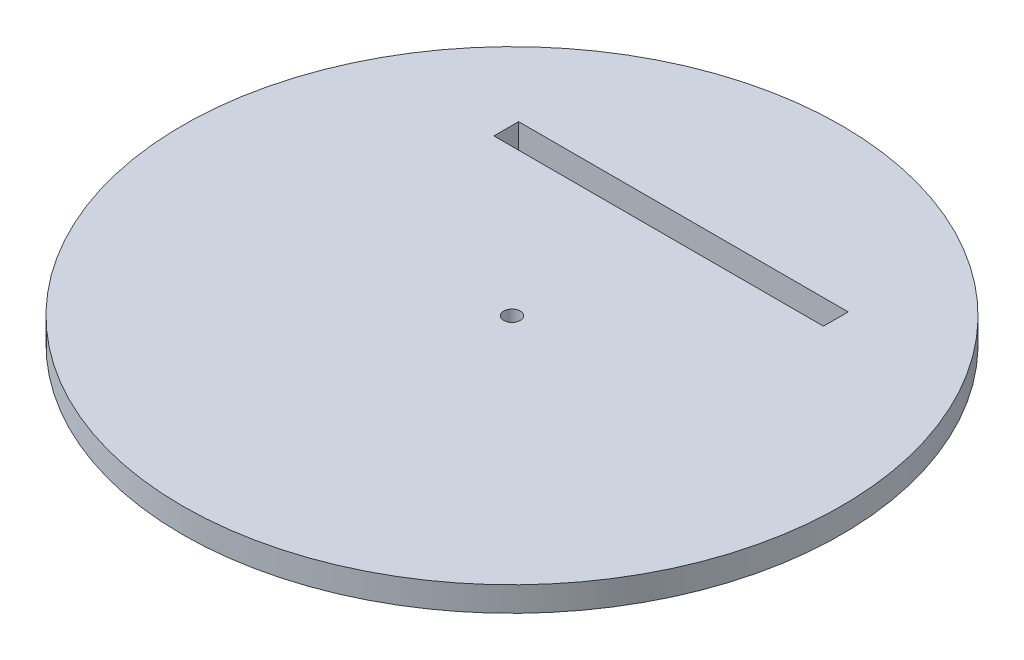
ISO-10303-21;
HEADER;
FILE_DESCRIPTION(('STEP AP214'),'2;1');
FILE_NAME('part.step','',(''),(''),'','','');
FILE_SCHEMA(('AUTOMOTIVE_DESIGN { 1 0 10303 214 1 1 1 1 }'));
ENDSEC;
DATA;
#1=APPLICATION_CONTEXT('core data for automotive mechanical design processes');
#2=APPLICATION_PROTOCOL_DEFINITION('international standard','automotive_design',2000,#1);
#3=PRODUCT_CONTEXT('',#1,'mechanical');
#4=PRODUCT('Part','Part','',(#3));
#5=PRODUCT_RELATED_PRODUCT_CATEGORY('part','',(#4));
#6=PRODUCT_DEFINITION_FORMATION('','',#4);
#7=PRODUCT_DEFINITION_CONTEXT('part definition',#1,'design');
#8=PRODUCT_DEFINITION('design','',#6,#7);
#9=PRODUCT_DEFINITION_SHAPE('','',#8);
#10=(LENGTH_UNIT() NAMED_UNIT(*) SI_UNIT(.MILLI.,.METRE.));
#11=(NAMED_UNIT(*) PLANE_ANGLE_UNIT() SI_UNIT($,.RADIAN.));
#12=(NAMED_UNIT(*) SI_UNIT($,.STERADIAN.) SOLID_ANGLE_UNIT());
#13=UNCERTAINTY_MEASURE_WITH_UNIT(LENGTH_MEASURE(1.E-05),#10,'distance_accuracy_value','');
#14=(GEOMETRIC_REPRESENTATION_CONTEXT(3) GLOBAL_UNCERTAINTY_ASSIGNED_CONTEXT((#13)) GLOBAL_UNIT_ASSIGNED_CONTEXT((#10,
#11,#12)) REPRESENTATION_CONTEXT('',''));
#15=CARTESIAN_POINT('',(0.,0.,0.));
#16=DIRECTION('',(0.,0.,1.));
#17=DIRECTION('',(1.,0.,0.));
#18=AXIS2_PLACEMENT_3D('',#15,#16,#17);
#19=CARTESIAN_POINT('',(0.,3.,0.));
#20=DIRECTION('',(0.,-1.,0.));
#21=DIRECTION('',(0.,0.,-1.));
#22=AXIS2_PLACEMENT_3D('',#19,#20,#21);
#23=CYLINDRICAL_SURFACE('',#22,40.);
#24=CARTESIAN_POINT('',(0.,3.,0.));
#25=DIRECTION('',(0.,1.,0.));
#26=DIRECTION('',(0.,0.,1.));
#27=AXIS2_PLACEMENT_3D('',#24,#25,#26);
#28=CIRCLE('',#27,40.);
#29=CARTESIAN_POINT('',(0.,3.,40.));
#30=VERTEX_POINT('',#29);
#31=EDGE_CURVE('E108',#30,#30,#28,.T.);
#32=ORIENTED_EDGE('',*,*,#31,.F.);
#33=EDGE_LOOP('',(#32));
#34=FACE_BOUND('',#33,.T.);
#35=CARTESIAN_POINT('',(0.,0.,0.));
#36=DIRECTION('',(0.,1.,0.));
#37=DIRECTION('',(0.,0.,1.));
#38=AXIS2_PLACEMENT_3D('',#35,#36,#37);
#39=CIRCLE('',#38,40.);
#40=CARTESIAN_POINT('',(0.,0.,40.));
#41=VERTEX_POINT('',#40);
#42=EDGE_CURVE('E105',#41,#41,#39,.T.);
#43=ORIENTED_EDGE('',*,*,#42,.T.);
#44=EDGE_LOOP('',(#43));
#45=FACE_BOUND('',#44,.T.);
#46=ADVANCED_FACE('F33',(#34,#45),#23,.T.);
#47=CARTESIAN_POINT('',(0.,3.,0.));
#48=DIRECTION('',(0.,1.,0.));
#49=DIRECTION('',(0.,0.,1.));
#50=AXIS2_PLACEMENT_3D('',#47,#48,#49);
#51=PLANE('',#50);
#52=DIRECTION('',(0.,0.,1.));
#53=VECTOR('',#52,1.);
#54=CARTESIAN_POINT('',(-20.,3.,-20.8028373281195));
#55=LINE('',#54,#53);
#56=CARTESIAN_POINT('',(-20.,3.,-20.8028373281195));
#57=VERTEX_POINT('',#56);
#58=CARTESIAN_POINT('',(-20.,3.,-17.8028373281195));
#59=VERTEX_POINT('',#58);
#60=EDGE_CURVE('E47',#57,#59,#55,.T.);
#61=ORIENTED_EDGE('',*,*,#60,.F.);
#62=DIRECTION('',(-1.,0.,0.));
#63=VECTOR('',#62,1.);
#64=CARTESIAN_POINT('',(-20.,3.,-20.8028373281195));
#65=LINE('',#64,#63);
#66=CARTESIAN_POINT('',(20.,3.,-20.8028373281195));
#67=VERTEX_POINT('',#66);
#68=EDGE_CURVE('E92',#67,#57,#65,.T.);
#69=ORIENTED_EDGE('',*,*,#68,.F.);
#70=DIRECTION('',(0.,0.,-1.));
#71=VECTOR('',#70,1.);
#72=CARTESIAN_POINT('',(20.,3.,-20.8028373281195));
#73=LINE('',#72,#71);
#74=CARTESIAN_POINT('',(20.,3.,-17.8028373281195));
#75=VERTEX_POINT('',#74);
#76=EDGE_CURVE('E76',#75,#67,#73,.T.);
#77=ORIENTED_EDGE('',*,*,#76,.F.);
#78=DIRECTION('',(1.,0.,0.));
#79=VECTOR('',#78,1.);
#80=CARTESIAN_POINT('',(-20.,3.,-17.8028373281195));
#81=LINE('',#80,#79);
#82=EDGE_CURVE('E85',#59,#75,#81,.T.);
#83=ORIENTED_EDGE('',*,*,#82,.F.);
#84=EDGE_LOOP('',(#61,#69,#77,#83));
#85=FACE_BOUND('',#84,.T.);
#86=CARTESIAN_POINT('',(0.,3.,0.));
#87=DIRECTION('',(0.,1.,0.));
#88=DIRECTION('',(0.,0.,1.));
#89=AXIS2_PLACEMENT_3D('',#86,#87,#88);
#90=CIRCLE('',#89,1.);
#91=CARTESIAN_POINT('',(0.,3.,1.));
#92=VERTEX_POINT('',#91);
#93=EDGE_CURVE('E99',#92,#92,#90,.T.);
#94=ORIENTED_EDGE('',*,*,#93,.F.);
#95=EDGE_LOOP('',(#94));
#96=FACE_BOUND('',#95,.T.);
#97=ORIENTED_EDGE('',*,*,#31,.T.);
#98=EDGE_LOOP('',(#97));
#99=FACE_BOUND('',#98,.T.);
#100=ADVANCED_FACE('F89',(#85,#96,#99),#51,.T.);
#101=CARTESIAN_POINT('',(0.,0.,0.));
#102=DIRECTION('',(0.,1.,0.));
#103=DIRECTION('',(0.,0.,1.));
#104=AXIS2_PLACEMENT_3D('',#101,#102,#103);
#105=PLANE('',#104);
#106=DIRECTION('',(-1.,0.,0.));
#107=VECTOR('',#106,1.);
#108=CARTESIAN_POINT('',(0.,0.,-20.8028373281195));
#109=LINE('',#108,#107);
#110=CARTESIAN_POINT('',(20.,0.,-20.8028373281195));
#111=VERTEX_POINT('',#110);
#112=CARTESIAN_POINT('',(-20.,0.,-20.8028373281195));
#113=VERTEX_POINT('',#112);
#114=EDGE_CURVE('E40',#111,#113,#109,.T.);
#115=ORIENTED_EDGE('',*,*,#114,.T.);
#116=DIRECTION('',(0.,0.,1.));
#117=VECTOR('',#116,1.);
#118=CARTESIAN_POINT('',(-20.,0.,0.));
#119=LINE('',#118,#117);
#120=CARTESIAN_POINT('',(-20.,0.,-17.8028373281195));
#121=VERTEX_POINT('',#120);
#122=EDGE_CURVE('E11',#113,#121,#119,.T.);
#123=ORIENTED_EDGE('',*,*,#122,.T.);
#124=DIRECTION('',(1.,0.,0.));
#125=VECTOR('',#124,1.);
#126=CARTESIAN_POINT('',(0.,0.,-17.8028373281195));
#127=LINE('',#126,#125);
#128=CARTESIAN_POINT('',(20.,0.,-17.8028373281195));
#129=VERTEX_POINT('',#128);
#130=EDGE_CURVE('E111',#121,#129,#127,.T.);
#131=ORIENTED_EDGE('',*,*,#130,.T.);
#132=DIRECTION('',(0.,0.,-1.));
#133=VECTOR('',#132,1.);
#134=CARTESIAN_POINT('',(20.,0.,0.));
#135=LINE('',#134,#133);
#136=EDGE_CURVE('E79',#129,#111,#135,.T.);
#137=ORIENTED_EDGE('',*,*,#136,.T.);
#138=EDGE_LOOP('',(#115,#123,#131,#137));
#139=FACE_BOUND('',#138,.T.);
#140=CARTESIAN_POINT('',(0.,0.,0.));
#141=DIRECTION('',(0.,1.,0.));
#142=DIRECTION('',(0.,0.,1.));
#143=AXIS2_PLACEMENT_3D('',#140,#141,#142);
#144=CIRCLE('',#143,1.);
#145=CARTESIAN_POINT('',(0.,0.,1.));
#146=VERTEX_POINT('',#145);
#147=EDGE_CURVE('E102',#146,#146,#144,.T.);
#148=ORIENTED_EDGE('',*,*,#147,.T.);
#149=EDGE_LOOP('',(#148));
#150=FACE_BOUND('',#149,.T.);
#151=ORIENTED_EDGE('',*,*,#42,.F.);
#152=EDGE_LOOP('',(#151));
#153=FACE_BOUND('',#152,.T.);
#154=ADVANCED_FACE('F117',(#139,#150,#153),#105,.F.);
#155=CARTESIAN_POINT('',(0.,0.,0.));
#156=DIRECTION('',(0.,1.,0.));
#157=DIRECTION('',(0.,0.,1.));
#158=AXIS2_PLACEMENT_3D('',#155,#156,#157);
#159=CYLINDRICAL_SURFACE('',#158,1.);
#160=ORIENTED_EDGE('',*,*,#147,.F.);
#161=EDGE_LOOP('',(#160));
#162=FACE_BOUND('',#161,.T.);
#163=ORIENTED_EDGE('',*,*,#93,.T.);
#164=EDGE_LOOP('',(#163));
#165=FACE_BOUND('',#164,.T.);
#166=ADVANCED_FACE('F124',(#162,#165),#159,.F.);
#167=CARTESIAN_POINT('',(-20.,-7.,-20.8028373281195));
#168=DIRECTION('',(-1.,0.,0.));
#169=DIRECTION('',(0.,0.,1.));
#170=AXIS2_PLACEMENT_3D('',#167,#168,#169);
#171=PLANE('',#170);
#172=DIRECTION('',(0.,1.,0.));
#173=VECTOR('',#172,1.);
#174=CARTESIAN_POINT('',(-20.,-7.,-20.8028373281195));
#175=LINE('',#174,#173);
#176=EDGE_CURVE('E97',#113,#57,#175,.T.);
#177=ORIENTED_EDGE('',*,*,#176,.T.);
#178=ORIENTED_EDGE('',*,*,#60,.T.);
#179=DIRECTION('',(0.,1.,0.));
#180=VECTOR('',#179,1.);
#181=CARTESIAN_POINT('',(-20.,-7.,-17.8028373281195));
#182=LINE('',#181,#180);
#183=EDGE_CURVE('E82',#121,#59,#182,.T.);
#184=ORIENTED_EDGE('',*,*,#183,.F.);
#185=ORIENTED_EDGE('',*,*,#122,.F.);
#186=EDGE_LOOP('',(#177,#178,#184,#185));
#187=FACE_BOUND('',#186,.T.);
#188=ADVANCED_FACE('F122',(#187),#171,.F.);
#189=CARTESIAN_POINT('',(-20.,-7.,-20.8028373281195));
#190=DIRECTION('',(0.,0.,-1.));
#191=DIRECTION('',(-1.,0.,0.));
#192=AXIS2_PLACEMENT_3D('',#189,#190,#191);
#193=PLANE('',#192);
#194=DIRECTION('',(0.,1.,0.));
#195=VECTOR('',#194,1.);
#196=CARTESIAN_POINT('',(20.,-7.,-20.8028373281195));
#197=LINE('',#196,#195);
#198=EDGE_CURVE('E81',#111,#67,#197,.T.);
#199=ORIENTED_EDGE('',*,*,#198,.T.);
#200=ORIENTED_EDGE('',*,*,#68,.T.);
#201=ORIENTED_EDGE('',*,*,#176,.F.);
#202=ORIENTED_EDGE('',*,*,#114,.F.);
#203=EDGE_LOOP('',(#199,#200,#201,#202));
#204=FACE_BOUND('',#203,.T.);
#205=ADVANCED_FACE('F121',(#204),#193,.F.);
#206=CARTESIAN_POINT('',(20.,-7.,-20.8028373281195));
#207=DIRECTION('',(1.,0.,0.));
#208=DIRECTION('',(0.,0.,-1.));
#209=AXIS2_PLACEMENT_3D('',#206,#207,#208);
#210=PLANE('',#209);
#211=DIRECTION('',(0.,1.,0.));
#212=VECTOR('',#211,1.);
#213=CARTESIAN_POINT('',(20.,-7.,-17.8028373281195));
#214=LINE('',#213,#212);
#215=EDGE_CURVE('E55',#129,#75,#214,.T.);
#216=ORIENTED_EDGE('',*,*,#215,.T.);
#217=ORIENTED_EDGE('',*,*,#76,.T.);
#218=ORIENTED_EDGE('',*,*,#198,.F.);
#219=ORIENTED_EDGE('',*,*,#136,.F.);
#220=EDGE_LOOP('',(#216,#217,#218,#219));
#221=FACE_BOUND('',#220,.T.);
#222=ADVANCED_FACE('F73',(#221),#210,.F.);
#223=CARTESIAN_POINT('',(-20.,-7.,-17.8028373281195));
#224=DIRECTION('',(0.,0.,1.));
#225=DIRECTION('',(1.,0.,0.));
#226=AXIS2_PLACEMENT_3D('',#223,#224,#225);
#227=PLANE('',#226);
#228=ORIENTED_EDGE('',*,*,#183,.T.);
#229=ORIENTED_EDGE('',*,*,#82,.T.);
#230=ORIENTED_EDGE('',*,*,#215,.F.);
#231=ORIENTED_EDGE('',*,*,#130,.F.);
#232=EDGE_LOOP('',(#228,#229,#230,#231));
#233=FACE_BOUND('',#232,.T.);
#234=ADVANCED_FACE('F86',(#233),#227,.F.);
#235=CLOSED_SHELL('',(#46,#100,#154,#166,#188,#205,#222,#234));
#236=MANIFOLD_SOLID_BREP('B2',#235);
#237=ADVANCED_BREP_SHAPE_REPRESENTATION('',(#18,#236),#14);
#238=SHAPE_DEFINITION_REPRESENTATION(#9,#237);
ENDSEC;
END-ISO-10303-21;
